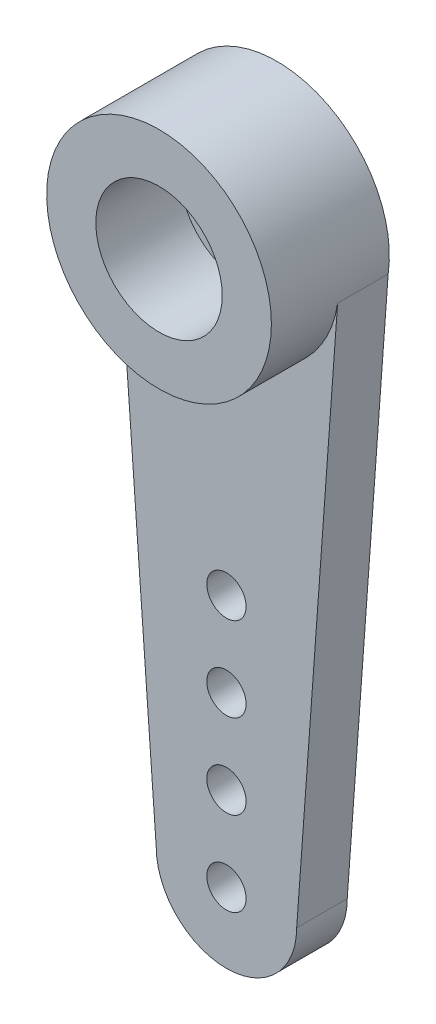
ISO-10303-21;
HEADER;
FILE_DESCRIPTION(('STEP AP214'),'2;1');
FILE_NAME('part.step','',(''),(''),'','','');
FILE_SCHEMA(('AUTOMOTIVE_DESIGN { 1 0 10303 214 1 1 1 1 }'));
ENDSEC;
DATA;
#1=APPLICATION_CONTEXT('core data for automotive mechanical design processes');
#2=APPLICATION_PROTOCOL_DEFINITION('international standard','automotive_design',2000,#1);
#3=PRODUCT_CONTEXT('',#1,'mechanical');
#4=PRODUCT('Part','Part','',(#3));
#5=PRODUCT_RELATED_PRODUCT_CATEGORY('part','',(#4));
#6=PRODUCT_DEFINITION_FORMATION('','',#4);
#7=PRODUCT_DEFINITION_CONTEXT('part definition',#1,'design');
#8=PRODUCT_DEFINITION('design','',#6,#7);
#9=PRODUCT_DEFINITION_SHAPE('','',#8);
#10=(LENGTH_UNIT() NAMED_UNIT(*) SI_UNIT(.MILLI.,.METRE.));
#11=(NAMED_UNIT(*) PLANE_ANGLE_UNIT() SI_UNIT($,.RADIAN.));
#12=(NAMED_UNIT(*) SI_UNIT($,.STERADIAN.) SOLID_ANGLE_UNIT());
#13=UNCERTAINTY_MEASURE_WITH_UNIT(LENGTH_MEASURE(1.E-05),#10,'distance_accuracy_value','');
#14=(GEOMETRIC_REPRESENTATION_CONTEXT(3) GLOBAL_UNCERTAINTY_ASSIGNED_CONTEXT((#13)) GLOBAL_UNIT_ASSIGNED_CONTEXT((#10,
#11,#12)) REPRESENTATION_CONTEXT('',''));
#15=CARTESIAN_POINT('',(0.,0.,0.));
#16=DIRECTION('',(0.,0.,1.));
#17=DIRECTION('',(1.,0.,0.));
#18=AXIS2_PLACEMENT_3D('',#15,#16,#17);
#19=CARTESIAN_POINT('',(0.,0.,4.2));
#20=DIRECTION('',(0.,0.,1.));
#21=DIRECTION('',(1.,0.,0.));
#22=AXIS2_PLACEMENT_3D('',#19,#20,#21);
#23=PLANE('',#22);
#24=CARTESIAN_POINT('',(0.,0.,4.2));
#25=DIRECTION('',(0.,0.,1.));
#26=DIRECTION('',(1.,0.,0.));
#27=AXIS2_PLACEMENT_3D('',#24,#25,#26);
#28=CIRCLE('',#27,4.);
#29=CARTESIAN_POINT('',(4.,0.,4.2));
#30=VERTEX_POINT('',#29);
#31=EDGE_CURVE('E45',#30,#30,#28,.T.);
#32=ORIENTED_EDGE('',*,*,#31,.T.);
#33=EDGE_LOOP('',(#32));
#34=FACE_BOUND('',#33,.T.);
#35=CARTESIAN_POINT('',(0.,0.,4.2));
#36=DIRECTION('',(0.,0.,1.));
#37=DIRECTION('',(1.,0.,0.));
#38=AXIS2_PLACEMENT_3D('',#35,#36,#37);
#39=CIRCLE('',#38,2.25);
#40=CARTESIAN_POINT('',(2.25,0.,4.2));
#41=VERTEX_POINT('',#40);
#42=EDGE_CURVE('E136',#41,#41,#39,.T.);
#43=ORIENTED_EDGE('',*,*,#42,.F.);
#44=EDGE_LOOP('',(#43));
#45=FACE_BOUND('',#44,.T.);
#46=ADVANCED_FACE('F37',(#34,#45),#23,.T.);
#47=CARTESIAN_POINT('',(0.,0.,0.));
#48=DIRECTION('',(0.,0.,1.));
#49=DIRECTION('',(1.,0.,0.));
#50=AXIS2_PLACEMENT_3D('',#47,#48,#49);
#51=PLANE('',#50);
#52=CARTESIAN_POINT('',(0.,-20.565998313313,0.));
#53=DIRECTION('',(0.,0.,1.));
#54=DIRECTION('',(1.,0.,0.));
#55=AXIS2_PLACEMENT_3D('',#52,#53,#54);
#56=CIRCLE('',#55,0.7);
#57=CARTESIAN_POINT('',(0.7,-20.565998313313,0.));
#58=VERTEX_POINT('',#57);
#59=EDGE_CURVE('E99',#58,#58,#56,.T.);
#60=ORIENTED_EDGE('',*,*,#59,.T.);
#61=EDGE_LOOP('',(#60));
#62=FACE_BOUND('',#61,.T.);
#63=CARTESIAN_POINT('',(0.,-17.565998313313,0.));
#64=DIRECTION('',(0.,0.,1.));
#65=DIRECTION('',(1.,0.,0.));
#66=AXIS2_PLACEMENT_3D('',#63,#64,#65);
#67=CIRCLE('',#66,0.699999999999999);
#68=CARTESIAN_POINT('',(0.699999999999999,-17.565998313313,0.));
#69=VERTEX_POINT('',#68);
#70=EDGE_CURVE('E128',#69,#69,#67,.T.);
#71=ORIENTED_EDGE('',*,*,#70,.T.);
#72=EDGE_LOOP('',(#71));
#73=FACE_BOUND('',#72,.T.);
#74=CARTESIAN_POINT('',(0.,-14.565998313313,0.));
#75=DIRECTION('',(0.,0.,1.));
#76=DIRECTION('',(1.,0.,0.));
#77=AXIS2_PLACEMENT_3D('',#74,#75,#76);
#78=CIRCLE('',#77,0.7);
#79=CARTESIAN_POINT('',(0.7,-14.565998313313,0.));
#80=VERTEX_POINT('',#79);
#81=EDGE_CURVE('E125',#80,#80,#78,.T.);
#82=ORIENTED_EDGE('',*,*,#81,.T.);
#83=EDGE_LOOP('',(#82));
#84=FACE_BOUND('',#83,.T.);
#85=CARTESIAN_POINT('',(0.,-11.565998313313,0.));
#86=DIRECTION('',(0.,0.,1.));
#87=DIRECTION('',(1.,0.,0.));
#88=AXIS2_PLACEMENT_3D('',#85,#86,#87);
#89=CIRCLE('',#88,0.7);
#90=CARTESIAN_POINT('',(0.7,-11.565998313313,0.));
#91=VERTEX_POINT('',#90);
#92=EDGE_CURVE('E122',#91,#91,#89,.T.);
#93=ORIENTED_EDGE('',*,*,#92,.T.);
#94=EDGE_LOOP('',(#93));
#95=FACE_BOUND('',#94,.T.);
#96=CARTESIAN_POINT('',(0.,0.,0.));
#97=DIRECTION('',(0.,0.,1.));
#98=DIRECTION('',(1.,0.,0.));
#99=AXIS2_PLACEMENT_3D('',#96,#97,#98);
#100=CIRCLE('',#99,4.);
#101=CARTESIAN_POINT('',(3.95766800435863,-0.580399833973082,0.));
#102=VERTEX_POINT('',#101);
#103=CARTESIAN_POINT('',(-3.95766800435863,-0.580399833973082,0.));
#104=VERTEX_POINT('',#103);
#105=EDGE_CURVE('E139',#102,#104,#100,.T.);
#106=ORIENTED_EDGE('',*,*,#105,.F.);
#107=DIRECTION('',(0.0727426934830686,0.997350740985752,0.));
#108=VECTOR('',#107,1.);
#109=CARTESIAN_POINT('',(3.97883400217932,-0.290199916986552,0.));
#110=LINE('',#109,#108);
#111=CARTESIAN_POINT('',(2.5,-20.565998313313,0.));
#112=VERTEX_POINT('',#111);
#113=EDGE_CURVE('E119',#112,#102,#110,.T.);
#114=ORIENTED_EDGE('',*,*,#113,.F.);
#115=CARTESIAN_POINT('',(0.,-20.565998313313,0.));
#116=DIRECTION('',(0.,0.,1.));
#117=DIRECTION('',(1.,0.,0.));
#118=AXIS2_PLACEMENT_3D('',#115,#116,#117);
#119=CIRCLE('',#118,2.5);
#120=CARTESIAN_POINT('',(-2.5,-20.565998313313,0.));
#121=VERTEX_POINT('',#120);
#122=EDGE_CURVE('E117',#121,#112,#119,.T.);
#123=ORIENTED_EDGE('',*,*,#122,.F.);
#124=DIRECTION('',(-0.0727426934830686,0.997350740985752,0.));
#125=VECTOR('',#124,1.);
#126=CARTESIAN_POINT('',(-3.97883400217932,-0.290199916986552,0.));
#127=LINE('',#126,#125);
#128=EDGE_CURVE('E83',#121,#104,#127,.T.);
#129=ORIENTED_EDGE('',*,*,#128,.T.);
#130=EDGE_LOOP('',(#106,#114,#123,#129));
#131=FACE_BOUND('',#130,.T.);
#132=ADVANCED_FACE('F144',(#62,#73,#84,#95,#131),#51,.F.);
#133=CARTESIAN_POINT('',(0.,0.,4.2));
#134=DIRECTION('',(0.,0.,-1.));
#135=DIRECTION('',(-1.,0.,0.));
#136=AXIS2_PLACEMENT_3D('',#133,#134,#135);
#137=CYLINDRICAL_SURFACE('',#136,4.);
#138=ORIENTED_EDGE('',*,*,#31,.F.);
#139=EDGE_LOOP('',(#138));
#140=FACE_BOUND('',#139,.T.);
#141=ORIENTED_EDGE('',*,*,#105,.T.);
#142=DIRECTION('',(0.,0.,-1.));
#143=VECTOR('',#142,1.);
#144=CARTESIAN_POINT('',(-3.95766800435863,-0.580399833973082,1.8));
#145=LINE('',#144,#143);
#146=CARTESIAN_POINT('',(-3.95766800435863,-0.580399833973082,1.8));
#147=VERTEX_POINT('',#146);
#148=EDGE_CURVE('E57',#147,#104,#145,.T.);
#149=ORIENTED_EDGE('',*,*,#148,.F.);
#150=CARTESIAN_POINT('',(0.,0.,1.8));
#151=DIRECTION('',(0.,0.,1.));
#152=DIRECTION('',(1.,0.,0.));
#153=AXIS2_PLACEMENT_3D('',#150,#151,#152);
#154=CIRCLE('',#153,4.);
#155=CARTESIAN_POINT('',(3.95766800435863,-0.580399833973082,1.8));
#156=VERTEX_POINT('',#155);
#157=EDGE_CURVE('E52',#147,#156,#154,.T.);
#158=ORIENTED_EDGE('',*,*,#157,.T.);
#159=DIRECTION('',(0.,0.,-1.));
#160=VECTOR('',#159,1.);
#161=CARTESIAN_POINT('',(3.95766800435863,-0.580399833973082,1.8));
#162=LINE('',#161,#160);
#163=EDGE_CURVE('E115',#156,#102,#162,.T.);
#164=ORIENTED_EDGE('',*,*,#163,.T.);
#165=EDGE_LOOP('',(#141,#149,#158,#164));
#166=FACE_BOUND('',#165,.T.);
#167=ADVANCED_FACE('F39',(#140,#166),#137,.T.);
#168=CARTESIAN_POINT('',(0.,0.,4.2));
#169=DIRECTION('',(0.,0.,-1.));
#170=DIRECTION('',(-1.,0.,0.));
#171=AXIS2_PLACEMENT_3D('',#168,#169,#170);
#172=CYLINDRICAL_SURFACE('',#171,2.25);
#173=CARTESIAN_POINT('',(0.,0.,1.2));
#174=DIRECTION('',(0.,0.,1.));
#175=DIRECTION('',(1.,0.,0.));
#176=AXIS2_PLACEMENT_3D('',#173,#174,#175);
#177=CIRCLE('',#176,2.25);
#178=CARTESIAN_POINT('',(2.25,0.,1.2));
#179=VERTEX_POINT('',#178);
#180=EDGE_CURVE('E11',#179,#179,#177,.T.);
#181=ORIENTED_EDGE('',*,*,#180,.F.);
#182=EDGE_LOOP('',(#181));
#183=FACE_BOUND('',#182,.T.);
#184=ORIENTED_EDGE('',*,*,#42,.T.);
#185=EDGE_LOOP('',(#184));
#186=FACE_BOUND('',#185,.T.);
#187=ADVANCED_FACE('F170',(#183,#186),#172,.F.);
#188=CARTESIAN_POINT('',(-3.97883400217932,-0.290199916986552,1.8));
#189=DIRECTION('',(-0.997350740985752,-0.0727426934830685,0.));
#190=DIRECTION('',(0.0727426934830686,-0.997350740985752,0.));
#191=AXIS2_PLACEMENT_3D('',#188,#189,#190);
#192=PLANE('',#191);
#193=ORIENTED_EDGE('',*,*,#128,.F.);
#194=DIRECTION('',(0.,0.,-1.));
#195=VECTOR('',#194,1.);
#196=CARTESIAN_POINT('',(-2.5,-20.565998313313,1.8));
#197=LINE('',#196,#195);
#198=CARTESIAN_POINT('',(-2.5,-20.565998313313,1.8));
#199=VERTEX_POINT('',#198);
#200=EDGE_CURVE('E77',#199,#121,#197,.T.);
#201=ORIENTED_EDGE('',*,*,#200,.F.);
#202=DIRECTION('',(-0.0727426934830686,0.997350740985752,0.));
#203=VECTOR('',#202,1.);
#204=CARTESIAN_POINT('',(-3.97883400217932,-0.290199916986552,1.8));
#205=LINE('',#204,#203);
#206=EDGE_CURVE('E81',#199,#147,#205,.T.);
#207=ORIENTED_EDGE('',*,*,#206,.T.);
#208=ORIENTED_EDGE('',*,*,#148,.T.);
#209=EDGE_LOOP('',(#193,#201,#207,#208));
#210=FACE_BOUND('',#209,.T.);
#211=ADVANCED_FACE('F79',(#210),#192,.T.);
#212=CARTESIAN_POINT('',(0.,-20.565998313313,1.8));
#213=DIRECTION('',(0.,0.,-1.));
#214=DIRECTION('',(-1.,0.,0.));
#215=AXIS2_PLACEMENT_3D('',#212,#213,#214);
#216=CYLINDRICAL_SURFACE('',#215,2.5);
#217=ORIENTED_EDGE('',*,*,#122,.T.);
#218=DIRECTION('',(0.,0.,-1.));
#219=VECTOR('',#218,1.);
#220=CARTESIAN_POINT('',(2.5,-20.565998313313,1.8));
#221=LINE('',#220,#219);
#222=CARTESIAN_POINT('',(2.5,-20.565998313313,1.8));
#223=VERTEX_POINT('',#222);
#224=EDGE_CURVE('E86',#223,#112,#221,.T.);
#225=ORIENTED_EDGE('',*,*,#224,.F.);
#226=CARTESIAN_POINT('',(0.,-20.565998313313,1.8));
#227=DIRECTION('',(0.,0.,1.));
#228=DIRECTION('',(1.,0.,0.));
#229=AXIS2_PLACEMENT_3D('',#226,#227,#228);
#230=CIRCLE('',#229,2.5);
#231=EDGE_CURVE('E89',#199,#223,#230,.T.);
#232=ORIENTED_EDGE('',*,*,#231,.F.);
#233=ORIENTED_EDGE('',*,*,#200,.T.);
#234=EDGE_LOOP('',(#217,#225,#232,#233));
#235=FACE_BOUND('',#234,.T.);
#236=ADVANCED_FACE('F90',(#235),#216,.T.);
#237=CARTESIAN_POINT('',(0.,-17.565998313313,1.8));
#238=DIRECTION('',(0.,0.,-1.));
#239=DIRECTION('',(-1.,0.,0.));
#240=AXIS2_PLACEMENT_3D('',#237,#238,#239);
#241=CYLINDRICAL_SURFACE('',#240,0.699999999999999);
#242=CARTESIAN_POINT('',(0.,-17.565998313313,1.8));
#243=DIRECTION('',(0.,0.,1.));
#244=DIRECTION('',(1.,0.,0.));
#245=AXIS2_PLACEMENT_3D('',#242,#243,#244);
#246=CIRCLE('',#245,0.699999999999999);
#247=CARTESIAN_POINT('',(0.699999999999999,-17.565998313313,1.8));
#248=VERTEX_POINT('',#247);
#249=EDGE_CURVE('E109',#248,#248,#246,.T.);
#250=ORIENTED_EDGE('',*,*,#249,.T.);
#251=EDGE_LOOP('',(#250));
#252=FACE_BOUND('',#251,.T.);
#253=ORIENTED_EDGE('',*,*,#70,.F.);
#254=EDGE_LOOP('',(#253));
#255=FACE_BOUND('',#254,.T.);
#256=ADVANCED_FACE('F176',(#252,#255),#241,.F.);
#257=CARTESIAN_POINT('',(0.,-14.565998313313,1.8));
#258=DIRECTION('',(0.,0.,-1.));
#259=DIRECTION('',(-1.,0.,0.));
#260=AXIS2_PLACEMENT_3D('',#257,#258,#259);
#261=CYLINDRICAL_SURFACE('',#260,0.7);
#262=CARTESIAN_POINT('',(0.,-14.565998313313,1.8));
#263=DIRECTION('',(0.,0.,1.));
#264=DIRECTION('',(1.,0.,0.));
#265=AXIS2_PLACEMENT_3D('',#262,#263,#264);
#266=CIRCLE('',#265,0.7);
#267=CARTESIAN_POINT('',(0.7,-14.565998313313,1.8));
#268=VERTEX_POINT('',#267);
#269=EDGE_CURVE('E106',#268,#268,#266,.T.);
#270=ORIENTED_EDGE('',*,*,#269,.T.);
#271=EDGE_LOOP('',(#270));
#272=FACE_BOUND('',#271,.T.);
#273=ORIENTED_EDGE('',*,*,#81,.F.);
#274=EDGE_LOOP('',(#273));
#275=FACE_BOUND('',#274,.T.);
#276=ADVANCED_FACE('F157',(#272,#275),#261,.F.);
#277=CARTESIAN_POINT('',(0.,-11.565998313313,1.8));
#278=DIRECTION('',(0.,0.,-1.));
#279=DIRECTION('',(-1.,0.,0.));
#280=AXIS2_PLACEMENT_3D('',#277,#278,#279);
#281=CYLINDRICAL_SURFACE('',#280,0.7);
#282=CARTESIAN_POINT('',(0.,-11.565998313313,1.8));
#283=DIRECTION('',(0.,0.,1.));
#284=DIRECTION('',(1.,0.,0.));
#285=AXIS2_PLACEMENT_3D('',#282,#283,#284);
#286=CIRCLE('',#285,0.7);
#287=CARTESIAN_POINT('',(0.7,-11.565998313313,1.8));
#288=VERTEX_POINT('',#287);
#289=EDGE_CURVE('E103',#288,#288,#286,.T.);
#290=ORIENTED_EDGE('',*,*,#289,.T.);
#291=EDGE_LOOP('',(#290));
#292=FACE_BOUND('',#291,.T.);
#293=ORIENTED_EDGE('',*,*,#92,.F.);
#294=EDGE_LOOP('',(#293));
#295=FACE_BOUND('',#294,.T.);
#296=ADVANCED_FACE('F149',(#292,#295),#281,.F.);
#297=CARTESIAN_POINT('',(3.97883400217932,-0.290199916986552,1.8));
#298=DIRECTION('',(-0.997350740985752,0.0727426934830685,0.));
#299=DIRECTION('',(-0.0727426934830686,-0.997350740985752,0.));
#300=AXIS2_PLACEMENT_3D('',#297,#298,#299);
#301=PLANE('',#300);
#302=ORIENTED_EDGE('',*,*,#113,.T.);
#303=ORIENTED_EDGE('',*,*,#163,.F.);
#304=DIRECTION('',(0.0727426934830686,0.997350740985752,0.));
#305=VECTOR('',#304,1.);
#306=CARTESIAN_POINT('',(3.97883400217932,-0.290199916986552,1.8));
#307=LINE('',#306,#305);
#308=EDGE_CURVE('E94',#223,#156,#307,.T.);
#309=ORIENTED_EDGE('',*,*,#308,.F.);
#310=ORIENTED_EDGE('',*,*,#224,.T.);
#311=EDGE_LOOP('',(#302,#303,#309,#310));
#312=FACE_BOUND('',#311,.T.);
#313=ADVANCED_FACE('F146',(#312),#301,.F.);
#314=CARTESIAN_POINT('',(0.,-20.565998313313,1.8));
#315=DIRECTION('',(0.,0.,-1.));
#316=DIRECTION('',(-1.,0.,0.));
#317=AXIS2_PLACEMENT_3D('',#314,#315,#316);
#318=CYLINDRICAL_SURFACE('',#317,0.7);
#319=CARTESIAN_POINT('',(0.,-20.565998313313,1.8));
#320=DIRECTION('',(0.,0.,1.));
#321=DIRECTION('',(1.,0.,0.));
#322=AXIS2_PLACEMENT_3D('',#319,#320,#321);
#323=CIRCLE('',#322,0.7);
#324=CARTESIAN_POINT('',(0.7,-20.565998313313,1.8));
#325=VERTEX_POINT('',#324);
#326=EDGE_CURVE('E112',#325,#325,#323,.T.);
#327=ORIENTED_EDGE('',*,*,#326,.T.);
#328=EDGE_LOOP('',(#327));
#329=FACE_BOUND('',#328,.T.);
#330=ORIENTED_EDGE('',*,*,#59,.F.);
#331=EDGE_LOOP('',(#330));
#332=FACE_BOUND('',#331,.T.);
#333=ADVANCED_FACE('F148',(#329,#332),#318,.F.);
#334=CARTESIAN_POINT('',(0.,0.,1.8));
#335=DIRECTION('',(0.,0.,1.));
#336=DIRECTION('',(1.,0.,0.));
#337=AXIS2_PLACEMENT_3D('',#334,#335,#336);
#338=PLANE('',#337);
#339=ORIENTED_EDGE('',*,*,#157,.F.);
#340=ORIENTED_EDGE('',*,*,#206,.F.);
#341=ORIENTED_EDGE('',*,*,#231,.T.);
#342=ORIENTED_EDGE('',*,*,#308,.T.);
#343=EDGE_LOOP('',(#339,#340,#341,#342));
#344=FACE_BOUND('',#343,.T.);
#345=ORIENTED_EDGE('',*,*,#289,.F.);
#346=EDGE_LOOP('',(#345));
#347=FACE_BOUND('',#346,.T.);
#348=ORIENTED_EDGE('',*,*,#269,.F.);
#349=EDGE_LOOP('',(#348));
#350=FACE_BOUND('',#349,.T.);
#351=ORIENTED_EDGE('',*,*,#249,.F.);
#352=EDGE_LOOP('',(#351));
#353=FACE_BOUND('',#352,.T.);
#354=ORIENTED_EDGE('',*,*,#326,.F.);
#355=EDGE_LOOP('',(#354));
#356=FACE_BOUND('',#355,.T.);
#357=ADVANCED_FACE('F96',(#344,#347,#350,#353,#356),#338,.T.);
#358=CARTESIAN_POINT('',(0.,0.,1.2));
#359=DIRECTION('',(0.,0.,1.));
#360=DIRECTION('',(1.,0.,0.));
#361=AXIS2_PLACEMENT_3D('',#358,#359,#360);
#362=PLANE('',#361);
#363=ORIENTED_EDGE('',*,*,#180,.T.);
#364=EDGE_LOOP('',(#363));
#365=FACE_BOUND('',#364,.T.);
#366=ADVANCED_FACE('F191',(#365),#362,.T.);
#367=CLOSED_SHELL('',(#46,#132,#167,#187,#211,#236,#256,#276,#296,#313,#333,#357,#366));
#368=MANIFOLD_SOLID_BREP('B2',#367);
#369=ADVANCED_BREP_SHAPE_REPRESENTATION('',(#18,#368),#14);
#370=SHAPE_DEFINITION_REPRESENTATION(#9,#369);
ENDSEC;
END-ISO-10303-21;
